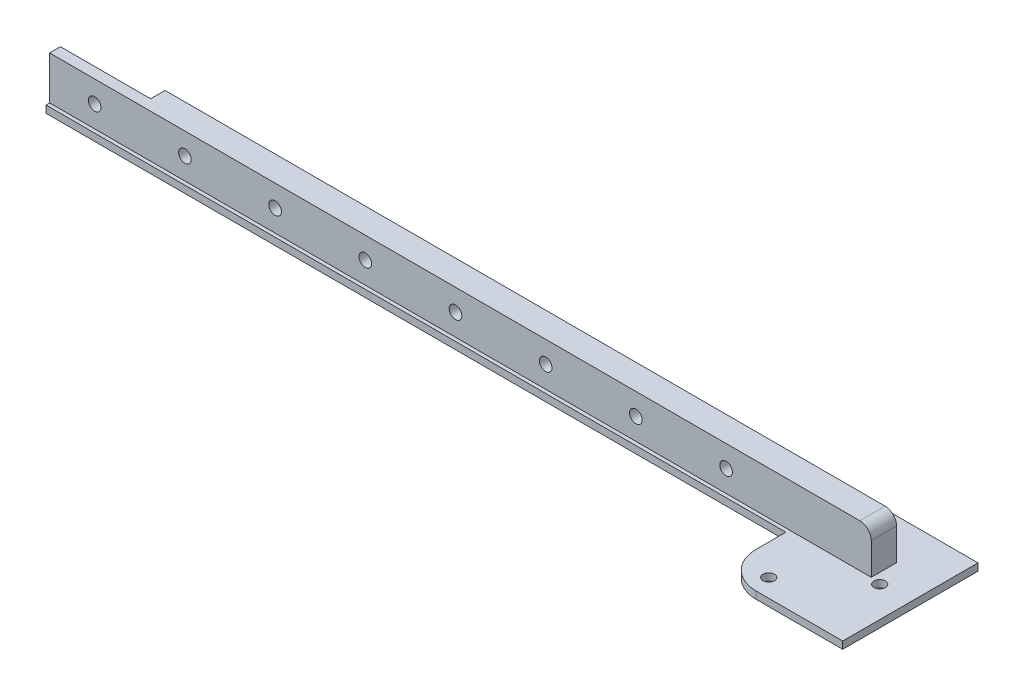
ISO-10303-21;
HEADER;
FILE_DESCRIPTION(('STEP AP214'),'2;1');
FILE_NAME('part.step','',(''),(''),'','','');
FILE_SCHEMA(('AUTOMOTIVE_DESIGN { 1 0 10303 214 1 1 1 1 }'));
ENDSEC;
DATA;
#1=APPLICATION_CONTEXT('core data for automotive mechanical design processes');
#2=APPLICATION_PROTOCOL_DEFINITION('international standard','automotive_design',2000,#1);
#3=PRODUCT_CONTEXT('',#1,'mechanical');
#4=PRODUCT('Part','Part','',(#3));
#5=PRODUCT_RELATED_PRODUCT_CATEGORY('part','',(#4));
#6=PRODUCT_DEFINITION_FORMATION('','',#4);
#7=PRODUCT_DEFINITION_CONTEXT('part definition',#1,'design');
#8=PRODUCT_DEFINITION('design','',#6,#7);
#9=PRODUCT_DEFINITION_SHAPE('','',#8);
#10=(LENGTH_UNIT() NAMED_UNIT(*) SI_UNIT(.MILLI.,.METRE.));
#11=(NAMED_UNIT(*) PLANE_ANGLE_UNIT() SI_UNIT($,.RADIAN.));
#12=(NAMED_UNIT(*) SI_UNIT($,.STERADIAN.) SOLID_ANGLE_UNIT());
#13=UNCERTAINTY_MEASURE_WITH_UNIT(LENGTH_MEASURE(1.E-05),#10,'distance_accuracy_value','');
#14=(GEOMETRIC_REPRESENTATION_CONTEXT(3) GLOBAL_UNCERTAINTY_ASSIGNED_CONTEXT((#13)) GLOBAL_UNIT_ASSIGNED_CONTEXT((#10,
#11,#12)) REPRESENTATION_CONTEXT('',''));
#15=CARTESIAN_POINT('',(0.,0.,0.));
#16=DIRECTION('',(0.,0.,1.));
#17=DIRECTION('',(1.,0.,0.));
#18=AXIS2_PLACEMENT_3D('',#15,#16,#17);
#19=CARTESIAN_POINT('',(-205.08,2.,-18.25));
#20=DIRECTION('',(1.,0.,0.));
#21=DIRECTION('',(0.,0.,-1.));
#22=AXIS2_PLACEMENT_3D('',#19,#20,#21);
#23=PLANE('',#22);
#24=DIRECTION('',(0.,1.,0.));
#25=VECTOR('',#24,1.);
#26=CARTESIAN_POINT('',(-205.08,14.,-22.25));
#27=LINE('',#26,#25);
#28=CARTESIAN_POINT('',(-205.08,0.,-22.25));
#29=VERTEX_POINT('',#28);
#30=CARTESIAN_POINT('',(-205.08,14.,-22.25));
#31=VERTEX_POINT('',#30);
#32=EDGE_CURVE('E176',#29,#31,#27,.T.);
#33=ORIENTED_EDGE('',*,*,#32,.F.);
#34=DIRECTION('',(0.,0.,1.));
#35=VECTOR('',#34,1.);
#36=CARTESIAN_POINT('',(-205.08,0.,-18.25));
#37=LINE('',#36,#35);
#38=CARTESIAN_POINT('',(-205.08,0.,-18.25));
#39=VERTEX_POINT('',#38);
#40=EDGE_CURVE('E175',#29,#39,#37,.T.);
#41=ORIENTED_EDGE('',*,*,#40,.T.);
#42=DIRECTION('',(0.,-1.,0.));
#43=VECTOR('',#42,1.);
#44=CARTESIAN_POINT('',(-205.08,2.,-18.25));
#45=LINE('',#44,#43);
#46=CARTESIAN_POINT('',(-205.08,2.,-18.25));
#47=VERTEX_POINT('',#46);
#48=EDGE_CURVE('E306',#47,#39,#45,.T.);
#49=ORIENTED_EDGE('',*,*,#48,.F.);
#50=DIRECTION('',(0.,0.,1.));
#51=VECTOR('',#50,1.);
#52=CARTESIAN_POINT('',(-205.08,2.,-18.25));
#53=LINE('',#52,#51);
#54=CARTESIAN_POINT('',(-205.08,2.,-19.25));
#55=VERTEX_POINT('',#54);
#56=EDGE_CURVE('E284',#55,#47,#53,.T.);
#57=ORIENTED_EDGE('',*,*,#56,.F.);
#58=DIRECTION('',(0.,-1.,0.));
#59=VECTOR('',#58,1.);
#60=CARTESIAN_POINT('',(-205.08,14.,-19.25));
#61=LINE('',#60,#59);
#62=CARTESIAN_POINT('',(-205.08,14.,-19.25));
#63=VERTEX_POINT('',#62);
#64=EDGE_CURVE('E249',#63,#55,#61,.T.);
#65=ORIENTED_EDGE('',*,*,#64,.F.);
#66=DIRECTION('',(0.,0.,1.));
#67=VECTOR('',#66,1.);
#68=CARTESIAN_POINT('',(-205.08,14.,-26.25));
#69=LINE('',#68,#67);
#70=EDGE_CURVE('E230',#31,#63,#69,.T.);
#71=ORIENTED_EDGE('',*,*,#70,.F.);
#72=EDGE_LOOP('',(#33,#41,#49,#57,#65,#71));
#73=FACE_BOUND('',#72,.T.);
#74=ADVANCED_FACE('F38',(#73),#23,.F.);
#75=CARTESIAN_POINT('',(-192.58,8.,-37.5));
#76=DIRECTION('',(0.,0.,1.));
#77=DIRECTION('',(1.,0.,0.));
#78=AXIS2_PLACEMENT_3D('',#75,#76,#77);
#79=CYLINDRICAL_SURFACE('',#78,1.75000000000001);
#80=CARTESIAN_POINT('',(-192.58,8.,-19.25));
#81=DIRECTION('',(0.,0.,1.));
#82=DIRECTION('',(1.,0.,0.));
#83=AXIS2_PLACEMENT_3D('',#80,#81,#82);
#84=CIRCLE('',#83,1.75000000000001);
#85=CARTESIAN_POINT('',(-190.83,8.,-19.25));
#86=VERTEX_POINT('',#85);
#87=EDGE_CURVE('E184',#86,#86,#84,.T.);
#88=ORIENTED_EDGE('',*,*,#87,.T.);
#89=EDGE_LOOP('',(#88));
#90=FACE_BOUND('',#89,.T.);
#91=CARTESIAN_POINT('',(-192.58,8.,-22.25));
#92=DIRECTION('',(0.,0.,-1.));
#93=DIRECTION('',(-1.,0.,0.));
#94=AXIS2_PLACEMENT_3D('',#91,#92,#93);
#95=CIRCLE('',#94,1.75000000000001);
#96=CARTESIAN_POINT('',(-194.33,8.,-22.25));
#97=VERTEX_POINT('',#96);
#98=EDGE_CURVE('E182',#97,#97,#95,.F.);
#99=ORIENTED_EDGE('',*,*,#98,.F.);
#100=EDGE_LOOP('',(#99));
#101=FACE_BOUND('',#100,.T.);
#102=ADVANCED_FACE('F402',(#90,#101),#79,.F.);
#103=CARTESIAN_POINT('',(0.,2.,0.));
#104=DIRECTION('',(0.,1.,0.));
#105=DIRECTION('',(0.,0.,1.));
#106=AXIS2_PLACEMENT_3D('',#103,#104,#105);
#107=PLANE('',#106);
#108=DIRECTION('',(-1.,0.,0.));
#109=VECTOR('',#108,1.);
#110=CARTESIAN_POINT('',(-205.08,2.,-26.25));
#111=LINE('',#110,#109);
#112=CARTESIAN_POINT('',(22.6666666666667,2.,-26.25));
#113=VERTEX_POINT('',#112);
#114=CARTESIAN_POINT('',(0.,2.,-26.25));
#115=VERTEX_POINT('',#114);
#116=EDGE_CURVE('E233',#113,#115,#111,.T.);
#117=ORIENTED_EDGE('',*,*,#116,.F.);
#118=DIRECTION('',(0.,0.,-1.));
#119=VECTOR('',#118,1.);
#120=CARTESIAN_POINT('',(22.6666666666667,2.,-26.25));
#121=LINE('',#120,#119);
#122=CARTESIAN_POINT('',(22.6666666666667,2.,-19.25));
#123=VERTEX_POINT('',#122);
#124=EDGE_CURVE('E241',#123,#113,#121,.T.);
#125=ORIENTED_EDGE('',*,*,#124,.F.);
#126=DIRECTION('',(1.,0.,0.));
#127=VECTOR('',#126,1.);
#128=CARTESIAN_POINT('',(-205.08,2.,-19.25));
#129=LINE('',#128,#127);
#130=EDGE_CURVE('E229',#55,#123,#129,.T.);
#131=ORIENTED_EDGE('',*,*,#130,.F.);
#132=ORIENTED_EDGE('',*,*,#56,.T.);
#133=DIRECTION('',(1.,0.,0.));
#134=VECTOR('',#133,1.);
#135=CARTESIAN_POINT('',(0.,2.,-18.25));
#136=LINE('',#135,#134);
#137=CARTESIAN_POINT('',(0.,2.,-18.25));
#138=VERTEX_POINT('',#137);
#139=EDGE_CURVE('E286',#47,#138,#136,.T.);
#140=ORIENTED_EDGE('',*,*,#139,.T.);
#141=DIRECTION('',(0.,0.,1.));
#142=VECTOR('',#141,1.);
#143=CARTESIAN_POINT('',(0.,2.,-18.25));
#144=LINE('',#143,#142);
#145=CARTESIAN_POINT('',(0.,2.,-9.99999999999999));
#146=VERTEX_POINT('',#145);
#147=EDGE_CURVE('E271',#138,#146,#144,.T.);
#148=ORIENTED_EDGE('',*,*,#147,.T.);
#149=CARTESIAN_POINT('',(9.99999999999999,2.,-10.));
#150=DIRECTION('',(0.,1.,0.));
#151=DIRECTION('',(0.,0.,1.));
#152=AXIS2_PLACEMENT_3D('',#149,#150,#151);
#153=CIRCLE('',#152,10.);
#154=CARTESIAN_POINT('',(9.99999999999999,2.,0.));
#155=VERTEX_POINT('',#154);
#156=EDGE_CURVE('E329',#146,#155,#153,.T.);
#157=ORIENTED_EDGE('',*,*,#156,.T.);
#158=DIRECTION('',(1.,0.,0.));
#159=VECTOR('',#158,1.);
#160=CARTESIAN_POINT('',(0.,2.,0.));
#161=LINE('',#160,#159);
#162=CARTESIAN_POINT('',(34.,2.,0.));
#163=VERTEX_POINT('',#162);
#164=EDGE_CURVE('E274',#155,#163,#161,.T.);
#165=ORIENTED_EDGE('',*,*,#164,.T.);
#166=DIRECTION('',(0.,0.,-1.));
#167=VECTOR('',#166,1.);
#168=CARTESIAN_POINT('',(34.,2.,0.));
#169=LINE('',#168,#167);
#170=CARTESIAN_POINT('',(34.,2.,-37.5));
#171=VERTEX_POINT('',#170);
#172=EDGE_CURVE('E277',#163,#171,#169,.T.);
#173=ORIENTED_EDGE('',*,*,#172,.T.);
#174=DIRECTION('',(-1.,0.,0.));
#175=VECTOR('',#174,1.);
#176=CARTESIAN_POINT('',(34.,2.,-37.5));
#177=LINE('',#176,#175);
#178=CARTESIAN_POINT('',(9.99999999999999,2.,-37.5));
#179=VERTEX_POINT('',#178);
#180=EDGE_CURVE('E279',#171,#179,#177,.T.);
#181=ORIENTED_EDGE('',*,*,#180,.T.);
#182=CARTESIAN_POINT('',(9.99999999999999,2.,-27.5));
#183=DIRECTION('',(0.,1.,0.));
#184=DIRECTION('',(0.,0.,1.));
#185=AXIS2_PLACEMENT_3D('',#182,#183,#184);
#186=CIRCLE('',#185,10.);
#187=CARTESIAN_POINT('',(0.,2.,-27.5));
#188=VERTEX_POINT('',#187);
#189=EDGE_CURVE('E327',#179,#188,#186,.T.);
#190=ORIENTED_EDGE('',*,*,#189,.T.);
#191=DIRECTION('',(0.,0.,1.));
#192=VECTOR('',#191,1.);
#193=CARTESIAN_POINT('',(0.,2.,-37.5));
#194=LINE('',#193,#192);
#195=EDGE_CURVE('E282',#188,#115,#194,.T.);
#196=ORIENTED_EDGE('',*,*,#195,.T.);
#197=EDGE_LOOP('',(#117,#125,#131,#132,#140,#148,#157,#165,#173,#181,#190,#196));
#198=FACE_BOUND('',#197,.T.);
#199=CARTESIAN_POINT('',(8.5,2.,-5.));
#200=DIRECTION('',(0.,1.,0.));
#201=DIRECTION('',(0.,0.,1.));
#202=AXIS2_PLACEMENT_3D('',#199,#200,#201);
#203=CIRCLE('',#202,1.59);
#204=CARTESIAN_POINT('',(8.5,2.,-3.41));
#205=VERTEX_POINT('',#204);
#206=EDGE_CURVE('E259',#205,#205,#203,.T.);
#207=ORIENTED_EDGE('',*,*,#206,.F.);
#208=EDGE_LOOP('',(#207));
#209=FACE_BOUND('',#208,.T.);
#210=CARTESIAN_POINT('',(8.5,2.,-32.5));
#211=DIRECTION('',(0.,1.,0.));
#212=DIRECTION('',(0.,0.,1.));
#213=AXIS2_PLACEMENT_3D('',#210,#211,#212);
#214=CIRCLE('',#213,1.59);
#215=CARTESIAN_POINT('',(8.5,2.,-30.91));
#216=VERTEX_POINT('',#215);
#217=EDGE_CURVE('E265',#216,#216,#214,.T.);
#218=ORIENTED_EDGE('',*,*,#217,.F.);
#219=EDGE_LOOP('',(#218));
#220=FACE_BOUND('',#219,.T.);
#221=CARTESIAN_POINT('',(25.5,2.,-18.75));
#222=DIRECTION('',(0.,1.,0.));
#223=DIRECTION('',(0.,0.,1.));
#224=AXIS2_PLACEMENT_3D('',#221,#222,#223);
#225=CIRCLE('',#224,1.59);
#226=CARTESIAN_POINT('',(25.5,2.,-17.16));
#227=VERTEX_POINT('',#226);
#228=EDGE_CURVE('E253',#227,#227,#225,.T.);
#229=ORIENTED_EDGE('',*,*,#228,.F.);
#230=EDGE_LOOP('',(#229));
#231=FACE_BOUND('',#230,.T.);
#232=ADVANCED_FACE('F364',(#198,#209,#220,#231),#107,.T.);
#233=CARTESIAN_POINT('',(0.,0.,0.));
#234=DIRECTION('',(0.,1.,0.));
#235=DIRECTION('',(0.,0.,1.));
#236=AXIS2_PLACEMENT_3D('',#233,#234,#235);
#237=PLANE('',#236);
#238=DIRECTION('',(-1.,0.,0.));
#239=VECTOR('',#238,1.);
#240=CARTESIAN_POINT('',(-180.08,0.,-22.25));
#241=LINE('',#240,#239);
#242=CARTESIAN_POINT('',(-180.08,0.,-22.25));
#243=VERTEX_POINT('',#242);
#244=EDGE_CURVE('E166',#243,#29,#241,.T.);
#245=ORIENTED_EDGE('',*,*,#244,.F.);
#246=DIRECTION('',(0.,0.,-1.));
#247=VECTOR('',#246,1.);
#248=CARTESIAN_POINT('',(-180.08,0.,-22.25));
#249=LINE('',#248,#247);
#250=CARTESIAN_POINT('',(-180.08,0.,-26.25));
#251=VERTEX_POINT('',#250);
#252=EDGE_CURVE('E148',#243,#251,#249,.T.);
#253=ORIENTED_EDGE('',*,*,#252,.T.);
#254=DIRECTION('',(-1.,0.,0.));
#255=VECTOR('',#254,1.);
#256=CARTESIAN_POINT('',(-205.08,0.,-26.25));
#257=LINE('',#256,#255);
#258=CARTESIAN_POINT('',(0.,0.,-26.25));
#259=VERTEX_POINT('',#258);
#260=EDGE_CURVE('E300',#259,#251,#257,.T.);
#261=ORIENTED_EDGE('',*,*,#260,.F.);
#262=DIRECTION('',(0.,0.,1.));
#263=VECTOR('',#262,1.);
#264=CARTESIAN_POINT('',(0.,0.,-37.5));
#265=LINE('',#264,#263);
#266=CARTESIAN_POINT('',(0.,0.,-27.5));
#267=VERTEX_POINT('',#266);
#268=EDGE_CURVE('E298',#267,#259,#265,.T.);
#269=ORIENTED_EDGE('',*,*,#268,.F.);
#270=CARTESIAN_POINT('',(9.99999999999999,0.,-27.5));
#271=DIRECTION('',(0.,1.,0.));
#272=DIRECTION('',(0.,0.,1.));
#273=AXIS2_PLACEMENT_3D('',#270,#271,#272);
#274=CIRCLE('',#273,10.);
#275=CARTESIAN_POINT('',(9.99999999999999,0.,-37.5));
#276=VERTEX_POINT('',#275);
#277=EDGE_CURVE('E321',#267,#276,#274,.F.);
#278=ORIENTED_EDGE('',*,*,#277,.T.);
#279=DIRECTION('',(-1.,0.,0.));
#280=VECTOR('',#279,1.);
#281=CARTESIAN_POINT('',(34.,0.,-37.5));
#282=LINE('',#281,#280);
#283=CARTESIAN_POINT('',(34.,0.,-37.5));
#284=VERTEX_POINT('',#283);
#285=EDGE_CURVE('E295',#284,#276,#282,.T.);
#286=ORIENTED_EDGE('',*,*,#285,.F.);
#287=DIRECTION('',(0.,0.,-1.));
#288=VECTOR('',#287,1.);
#289=CARTESIAN_POINT('',(34.,0.,0.));
#290=LINE('',#289,#288);
#291=CARTESIAN_POINT('',(34.,0.,0.));
#292=VERTEX_POINT('',#291);
#293=EDGE_CURVE('E293',#292,#284,#290,.T.);
#294=ORIENTED_EDGE('',*,*,#293,.F.);
#295=DIRECTION('',(1.,0.,0.));
#296=VECTOR('',#295,1.);
#297=CARTESIAN_POINT('',(0.,0.,0.));
#298=LINE('',#297,#296);
#299=CARTESIAN_POINT('',(9.99999999999999,0.,0.));
#300=VERTEX_POINT('',#299);
#301=EDGE_CURVE('E291',#300,#292,#298,.T.);
#302=ORIENTED_EDGE('',*,*,#301,.F.);
#303=CARTESIAN_POINT('',(9.99999999999999,0.,-10.));
#304=DIRECTION('',(0.,1.,0.));
#305=DIRECTION('',(0.,0.,1.));
#306=AXIS2_PLACEMENT_3D('',#303,#304,#305);
#307=CIRCLE('',#306,10.);
#308=CARTESIAN_POINT('',(0.,0.,-9.99999999999999));
#309=VERTEX_POINT('',#308);
#310=EDGE_CURVE('E323',#300,#309,#307,.F.);
#311=ORIENTED_EDGE('',*,*,#310,.T.);
#312=DIRECTION('',(0.,0.,1.));
#313=VECTOR('',#312,1.);
#314=CARTESIAN_POINT('',(0.,0.,-18.25));
#315=LINE('',#314,#313);
#316=CARTESIAN_POINT('',(0.,0.,-18.25));
#317=VERTEX_POINT('',#316);
#318=EDGE_CURVE('E268',#317,#309,#315,.T.);
#319=ORIENTED_EDGE('',*,*,#318,.F.);
#320=DIRECTION('',(1.,0.,0.));
#321=VECTOR('',#320,1.);
#322=CARTESIAN_POINT('',(0.,0.,-18.25));
#323=LINE('',#322,#321);
#324=EDGE_CURVE('E275',#39,#317,#323,.T.);
#325=ORIENTED_EDGE('',*,*,#324,.F.);
#326=ORIENTED_EDGE('',*,*,#40,.F.);
#327=EDGE_LOOP('',(#245,#253,#261,#269,#278,#286,#294,#302,#311,#319,#325,#326));
#328=FACE_BOUND('',#327,.T.);
#329=CARTESIAN_POINT('',(8.5,0.,-32.5));
#330=DIRECTION('',(0.,1.,0.));
#331=DIRECTION('',(0.,0.,1.));
#332=AXIS2_PLACEMENT_3D('',#329,#330,#331);
#333=CIRCLE('',#332,1.59);
#334=CARTESIAN_POINT('',(8.5,0.,-30.91));
#335=VERTEX_POINT('',#334);
#336=EDGE_CURVE('E262',#335,#335,#333,.T.);
#337=ORIENTED_EDGE('',*,*,#336,.T.);
#338=EDGE_LOOP('',(#337));
#339=FACE_BOUND('',#338,.T.);
#340=CARTESIAN_POINT('',(8.5,0.,-5.));
#341=DIRECTION('',(0.,1.,0.));
#342=DIRECTION('',(0.,0.,1.));
#343=AXIS2_PLACEMENT_3D('',#340,#341,#342);
#344=CIRCLE('',#343,1.59);
#345=CARTESIAN_POINT('',(8.5,0.,-3.41));
#346=VERTEX_POINT('',#345);
#347=EDGE_CURVE('E256',#346,#346,#344,.T.);
#348=ORIENTED_EDGE('',*,*,#347,.T.);
#349=EDGE_LOOP('',(#348));
#350=FACE_BOUND('',#349,.T.);
#351=CARTESIAN_POINT('',(25.5,0.,-18.75));
#352=DIRECTION('',(0.,1.,0.));
#353=DIRECTION('',(0.,0.,1.));
#354=AXIS2_PLACEMENT_3D('',#351,#352,#353);
#355=CIRCLE('',#354,1.59);
#356=CARTESIAN_POINT('',(25.5,0.,-17.16));
#357=VERTEX_POINT('',#356);
#358=EDGE_CURVE('E252',#357,#357,#355,.T.);
#359=ORIENTED_EDGE('',*,*,#358,.T.);
#360=EDGE_LOOP('',(#359));
#361=FACE_BOUND('',#360,.T.);
#362=ADVANCED_FACE('F172',(#328,#339,#350,#361),#237,.F.);
#363=CARTESIAN_POINT('',(0.,2.,-18.25));
#364=DIRECTION('',(1.,0.,0.));
#365=DIRECTION('',(0.,0.,-1.));
#366=AXIS2_PLACEMENT_3D('',#363,#364,#365);
#367=PLANE('',#366);
#368=ORIENTED_EDGE('',*,*,#318,.T.);
#369=DIRECTION('',(0.,-1.,0.));
#370=VECTOR('',#369,1.);
#371=CARTESIAN_POINT('',(0.,2.,-9.99999999999999));
#372=LINE('',#371,#370);
#373=EDGE_CURVE('E325',#309,#146,#372,.F.);
#374=ORIENTED_EDGE('',*,*,#373,.T.);
#375=ORIENTED_EDGE('',*,*,#147,.F.);
#376=DIRECTION('',(0.,-1.,0.));
#377=VECTOR('',#376,1.);
#378=CARTESIAN_POINT('',(0.,2.,-18.25));
#379=LINE('',#378,#377);
#380=EDGE_CURVE('E288',#138,#317,#379,.T.);
#381=ORIENTED_EDGE('',*,*,#380,.T.);
#382=EDGE_LOOP('',(#368,#374,#375,#381));
#383=FACE_BOUND('',#382,.T.);
#384=ADVANCED_FACE('F384',(#383),#367,.F.);
#385=CARTESIAN_POINT('',(0.,2.,0.));
#386=DIRECTION('',(0.,0.,-1.));
#387=DIRECTION('',(-1.,0.,0.));
#388=AXIS2_PLACEMENT_3D('',#385,#386,#387);
#389=PLANE('',#388);
#390=ORIENTED_EDGE('',*,*,#164,.F.);
#391=DIRECTION('',(0.,-1.,0.));
#392=VECTOR('',#391,1.);
#393=CARTESIAN_POINT('',(9.99999999999999,2.,0.));
#394=LINE('',#393,#392);
#395=EDGE_CURVE('E318',#155,#300,#394,.T.);
#396=ORIENTED_EDGE('',*,*,#395,.T.);
#397=ORIENTED_EDGE('',*,*,#301,.T.);
#398=DIRECTION('',(0.,-1.,0.));
#399=VECTOR('',#398,1.);
#400=CARTESIAN_POINT('',(34.,2.,0.));
#401=LINE('',#400,#399);
#402=EDGE_CURVE('E315',#163,#292,#401,.T.);
#403=ORIENTED_EDGE('',*,*,#402,.F.);
#404=EDGE_LOOP('',(#390,#396,#397,#403));
#405=FACE_BOUND('',#404,.T.);
#406=ADVANCED_FACE('F376',(#405),#389,.F.);
#407=CARTESIAN_POINT('',(34.,2.,0.));
#408=DIRECTION('',(-1.,0.,0.));
#409=DIRECTION('',(0.,0.,1.));
#410=AXIS2_PLACEMENT_3D('',#407,#408,#409);
#411=PLANE('',#410);
#412=ORIENTED_EDGE('',*,*,#293,.T.);
#413=DIRECTION('',(0.,-1.,0.));
#414=VECTOR('',#413,1.);
#415=CARTESIAN_POINT('',(34.,2.,-37.5));
#416=LINE('',#415,#414);
#417=EDGE_CURVE('E312',#171,#284,#416,.T.);
#418=ORIENTED_EDGE('',*,*,#417,.F.);
#419=ORIENTED_EDGE('',*,*,#172,.F.);
#420=ORIENTED_EDGE('',*,*,#402,.T.);
#421=EDGE_LOOP('',(#412,#418,#419,#420));
#422=FACE_BOUND('',#421,.T.);
#423=ADVANCED_FACE('F371',(#422),#411,.F.);
#424=CARTESIAN_POINT('',(34.,2.,-37.5));
#425=DIRECTION('',(0.,0.,1.));
#426=DIRECTION('',(1.,0.,0.));
#427=AXIS2_PLACEMENT_3D('',#424,#425,#426);
#428=PLANE('',#427);
#429=ORIENTED_EDGE('',*,*,#285,.T.);
#430=DIRECTION('',(0.,-1.,0.));
#431=VECTOR('',#430,1.);
#432=CARTESIAN_POINT('',(9.99999999999999,2.,-37.5));
#433=LINE('',#432,#431);
#434=EDGE_CURVE('E334',#276,#179,#433,.F.);
#435=ORIENTED_EDGE('',*,*,#434,.T.);
#436=ORIENTED_EDGE('',*,*,#180,.F.);
#437=ORIENTED_EDGE('',*,*,#417,.T.);
#438=EDGE_LOOP('',(#429,#435,#436,#437));
#439=FACE_BOUND('',#438,.T.);
#440=ADVANCED_FACE('F361',(#439),#428,.F.);
#441=CARTESIAN_POINT('',(0.,2.,-37.5));
#442=DIRECTION('',(1.,0.,0.));
#443=DIRECTION('',(0.,0.,-1.));
#444=AXIS2_PLACEMENT_3D('',#441,#442,#443);
#445=PLANE('',#444);
#446=ORIENTED_EDGE('',*,*,#195,.F.);
#447=DIRECTION('',(0.,-1.,0.));
#448=VECTOR('',#447,1.);
#449=CARTESIAN_POINT('',(0.,2.,-27.5));
#450=LINE('',#449,#448);
#451=EDGE_CURVE('E331',#188,#267,#450,.T.);
#452=ORIENTED_EDGE('',*,*,#451,.T.);
#453=ORIENTED_EDGE('',*,*,#268,.T.);
#454=DIRECTION('',(0.,-1.,0.));
#455=VECTOR('',#454,1.);
#456=CARTESIAN_POINT('',(0.,2.,-26.25));
#457=LINE('',#456,#455);
#458=EDGE_CURVE('E309',#115,#259,#457,.T.);
#459=ORIENTED_EDGE('',*,*,#458,.F.);
#460=EDGE_LOOP('',(#446,#452,#453,#459));
#461=FACE_BOUND('',#460,.T.);
#462=ADVANCED_FACE('F353',(#461),#445,.F.);
#463=CARTESIAN_POINT('',(-205.08,2.,-26.25));
#464=DIRECTION('',(0.,0.,1.));
#465=DIRECTION('',(1.,0.,0.));
#466=AXIS2_PLACEMENT_3D('',#463,#464,#465);
#467=PLANE('',#466);
#468=CARTESIAN_POINT('',(-167.58,8.,-26.25));
#469=DIRECTION('',(0.,0.,1.));
#470=DIRECTION('',(1.,0.,0.));
#471=AXIS2_PLACEMENT_3D('',#468,#469,#470);
#472=CIRCLE('',#471,1.75000000000001);
#473=CARTESIAN_POINT('',(-165.83,8.,-26.25));
#474=VERTEX_POINT('',#473);
#475=EDGE_CURVE('E226',#474,#474,#472,.T.);
#476=ORIENTED_EDGE('',*,*,#475,.T.);
#477=EDGE_LOOP('',(#476));
#478=FACE_BOUND('',#477,.T.);
#479=CARTESIAN_POINT('',(-142.58,8.,-26.25));
#480=DIRECTION('',(0.,0.,1.));
#481=DIRECTION('',(1.,0.,0.));
#482=AXIS2_PLACEMENT_3D('',#479,#480,#481);
#483=CIRCLE('',#482,1.74999999999998);
#484=CARTESIAN_POINT('',(-140.83,8.,-26.25));
#485=VERTEX_POINT('',#484);
#486=EDGE_CURVE('E223',#485,#485,#483,.T.);
#487=ORIENTED_EDGE('',*,*,#486,.T.);
#488=EDGE_LOOP('',(#487));
#489=FACE_BOUND('',#488,.T.);
#490=CARTESIAN_POINT('',(-117.58,8.,-26.25));
#491=DIRECTION('',(0.,0.,1.));
#492=DIRECTION('',(1.,0.,0.));
#493=AXIS2_PLACEMENT_3D('',#490,#491,#492);
#494=CIRCLE('',#493,1.75000000000001);
#495=CARTESIAN_POINT('',(-115.83,8.,-26.25));
#496=VERTEX_POINT('',#495);
#497=EDGE_CURVE('E220',#496,#496,#494,.T.);
#498=ORIENTED_EDGE('',*,*,#497,.T.);
#499=EDGE_LOOP('',(#498));
#500=FACE_BOUND('',#499,.T.);
#501=CARTESIAN_POINT('',(-92.58,8.,-26.25));
#502=DIRECTION('',(0.,0.,1.));
#503=DIRECTION('',(1.,0.,0.));
#504=AXIS2_PLACEMENT_3D('',#501,#502,#503);
#505=CIRCLE('',#504,1.75000000000001);
#506=CARTESIAN_POINT('',(-90.83,8.,-26.25));
#507=VERTEX_POINT('',#506);
#508=EDGE_CURVE('E217',#507,#507,#505,.T.);
#509=ORIENTED_EDGE('',*,*,#508,.T.);
#510=EDGE_LOOP('',(#509));
#511=FACE_BOUND('',#510,.T.);
#512=CARTESIAN_POINT('',(-67.58,8.,-26.25));
#513=DIRECTION('',(0.,0.,1.));
#514=DIRECTION('',(1.,0.,0.));
#515=AXIS2_PLACEMENT_3D('',#512,#513,#514);
#516=CIRCLE('',#515,1.75000000000001);
#517=CARTESIAN_POINT('',(-65.83,8.,-26.25));
#518=VERTEX_POINT('',#517);
#519=EDGE_CURVE('E214',#518,#518,#516,.T.);
#520=ORIENTED_EDGE('',*,*,#519,.T.);
#521=EDGE_LOOP('',(#520));
#522=FACE_BOUND('',#521,.T.);
#523=CARTESIAN_POINT('',(-42.58,8.,-26.25));
#524=DIRECTION('',(0.,0.,1.));
#525=DIRECTION('',(1.,0.,0.));
#526=AXIS2_PLACEMENT_3D('',#523,#524,#525);
#527=CIRCLE('',#526,1.75000000000001);
#528=CARTESIAN_POINT('',(-40.83,8.,-26.25));
#529=VERTEX_POINT('',#528);
#530=EDGE_CURVE('E211',#529,#529,#527,.T.);
#531=ORIENTED_EDGE('',*,*,#530,.T.);
#532=EDGE_LOOP('',(#531));
#533=FACE_BOUND('',#532,.T.);
#534=CARTESIAN_POINT('',(-17.58,8.,-26.25));
#535=DIRECTION('',(0.,0.,1.));
#536=DIRECTION('',(1.,0.,0.));
#537=AXIS2_PLACEMENT_3D('',#534,#535,#536);
#538=CIRCLE('',#537,1.75000000000001);
#539=CARTESIAN_POINT('',(-15.83,8.,-26.25));
#540=VERTEX_POINT('',#539);
#541=EDGE_CURVE('E187',#540,#540,#538,.T.);
#542=ORIENTED_EDGE('',*,*,#541,.T.);
#543=EDGE_LOOP('',(#542));
#544=FACE_BOUND('',#543,.T.);
#545=DIRECTION('',(-1.,0.,0.));
#546=VECTOR('',#545,1.);
#547=CARTESIAN_POINT('',(-205.08,14.,-26.25));
#548=LINE('',#547,#546);
#549=CARTESIAN_POINT('',(19.4916666666667,14.,-26.25));
#550=VERTEX_POINT('',#549);
#551=CARTESIAN_POINT('',(-180.08,14.,-26.25));
#552=VERTEX_POINT('',#551);
#553=EDGE_CURVE('E236',#550,#552,#548,.T.);
#554=ORIENTED_EDGE('',*,*,#553,.F.);
#555=CARTESIAN_POINT('',(19.4916666666667,10.825,-26.25));
#556=DIRECTION('',(0.,0.,1.));
#557=DIRECTION('',(1.,0.,0.));
#558=AXIS2_PLACEMENT_3D('',#555,#556,#557);
#559=CIRCLE('',#558,3.175);
#560=CARTESIAN_POINT('',(22.6666666666667,10.825,-26.25));
#561=VERTEX_POINT('',#560);
#562=EDGE_CURVE('E60',#550,#561,#559,.F.);
#563=ORIENTED_EDGE('',*,*,#562,.T.);
#564=DIRECTION('',(0.,-1.,0.));
#565=VECTOR('',#564,1.);
#566=CARTESIAN_POINT('',(22.6666666666667,14.,-26.25));
#567=LINE('',#566,#565);
#568=EDGE_CURVE('E238',#561,#113,#567,.T.);
#569=ORIENTED_EDGE('',*,*,#568,.T.);
#570=ORIENTED_EDGE('',*,*,#116,.T.);
#571=ORIENTED_EDGE('',*,*,#458,.T.);
#572=ORIENTED_EDGE('',*,*,#260,.T.);
#573=DIRECTION('',(0.,-1.,0.));
#574=VECTOR('',#573,1.);
#575=CARTESIAN_POINT('',(-180.08,14.,-26.25));
#576=LINE('',#575,#574);
#577=EDGE_CURVE('E155',#552,#251,#576,.T.);
#578=ORIENTED_EDGE('',*,*,#577,.F.);
#579=EDGE_LOOP('',(#554,#563,#569,#570,#571,#572,#578));
#580=FACE_BOUND('',#579,.T.);
#581=ADVANCED_FACE('F347',(#478,#489,#500,#511,#522,#533,#544,#580),#467,.F.);
#582=CARTESIAN_POINT('',(0.,2.,-18.25));
#583=DIRECTION('',(0.,0.,-1.));
#584=DIRECTION('',(-1.,0.,0.));
#585=AXIS2_PLACEMENT_3D('',#582,#583,#584);
#586=PLANE('',#585);
#587=ORIENTED_EDGE('',*,*,#324,.T.);
#588=ORIENTED_EDGE('',*,*,#380,.F.);
#589=ORIENTED_EDGE('',*,*,#139,.F.);
#590=ORIENTED_EDGE('',*,*,#48,.T.);
#591=EDGE_LOOP('',(#587,#588,#589,#590));
#592=FACE_BOUND('',#591,.T.);
#593=ADVANCED_FACE('F390',(#592),#586,.F.);
#594=CARTESIAN_POINT('',(8.5,2.,-32.5));
#595=DIRECTION('',(0.,-1.,0.));
#596=DIRECTION('',(0.,0.,-1.));
#597=AXIS2_PLACEMENT_3D('',#594,#595,#596);
#598=CYLINDRICAL_SURFACE('',#597,1.59);
#599=ORIENTED_EDGE('',*,*,#217,.T.);
#600=EDGE_LOOP('',(#599));
#601=FACE_BOUND('',#600,.T.);
#602=ORIENTED_EDGE('',*,*,#336,.F.);
#603=EDGE_LOOP('',(#602));
#604=FACE_BOUND('',#603,.T.);
#605=ADVANCED_FACE('F448',(#601,#604),#598,.F.);
#606=CARTESIAN_POINT('',(8.5,2.,-5.));
#607=DIRECTION('',(0.,-1.,0.));
#608=DIRECTION('',(0.,0.,-1.));
#609=AXIS2_PLACEMENT_3D('',#606,#607,#608);
#610=CYLINDRICAL_SURFACE('',#609,1.59);
#611=ORIENTED_EDGE('',*,*,#206,.T.);
#612=EDGE_LOOP('',(#611));
#613=FACE_BOUND('',#612,.T.);
#614=ORIENTED_EDGE('',*,*,#347,.F.);
#615=EDGE_LOOP('',(#614));
#616=FACE_BOUND('',#615,.T.);
#617=ADVANCED_FACE('F444',(#613,#616),#610,.F.);
#618=CARTESIAN_POINT('',(25.5,2.,-18.75));
#619=DIRECTION('',(0.,-1.,0.));
#620=DIRECTION('',(0.,0.,-1.));
#621=AXIS2_PLACEMENT_3D('',#618,#619,#620);
#622=CYLINDRICAL_SURFACE('',#621,1.59);
#623=ORIENTED_EDGE('',*,*,#228,.T.);
#624=EDGE_LOOP('',(#623));
#625=FACE_BOUND('',#624,.T.);
#626=ORIENTED_EDGE('',*,*,#358,.F.);
#627=EDGE_LOOP('',(#626));
#628=FACE_BOUND('',#627,.T.);
#629=ADVANCED_FACE('F426',(#625,#628),#622,.F.);
#630=CARTESIAN_POINT('',(9.99999999999999,2.,-10.));
#631=DIRECTION('',(0.,-1.,0.));
#632=DIRECTION('',(0.,0.,-1.));
#633=AXIS2_PLACEMENT_3D('',#630,#631,#632);
#634=CYLINDRICAL_SURFACE('',#633,10.);
#635=ORIENTED_EDGE('',*,*,#156,.F.);
#636=ORIENTED_EDGE('',*,*,#373,.F.);
#637=ORIENTED_EDGE('',*,*,#310,.F.);
#638=ORIENTED_EDGE('',*,*,#395,.F.);
#639=EDGE_LOOP('',(#635,#636,#637,#638));
#640=FACE_BOUND('',#639,.T.);
#641=ADVANCED_FACE('F380',(#640),#634,.T.);
#642=CARTESIAN_POINT('',(9.99999999999999,2.,-27.5));
#643=DIRECTION('',(0.,-1.,0.));
#644=DIRECTION('',(0.,0.,-1.));
#645=AXIS2_PLACEMENT_3D('',#642,#643,#644);
#646=CYLINDRICAL_SURFACE('',#645,10.);
#647=ORIENTED_EDGE('',*,*,#189,.F.);
#648=ORIENTED_EDGE('',*,*,#434,.F.);
#649=ORIENTED_EDGE('',*,*,#277,.F.);
#650=ORIENTED_EDGE('',*,*,#451,.F.);
#651=EDGE_LOOP('',(#647,#648,#649,#650));
#652=FACE_BOUND('',#651,.T.);
#653=ADVANCED_FACE('F357',(#652),#646,.T.);
#654=CARTESIAN_POINT('',(-205.08,14.,-19.25));
#655=DIRECTION('',(0.,0.,-1.));
#656=DIRECTION('',(-1.,0.,0.));
#657=AXIS2_PLACEMENT_3D('',#654,#655,#656);
#658=PLANE('',#657);
#659=ORIENTED_EDGE('',*,*,#87,.F.);
#660=EDGE_LOOP('',(#659));
#661=FACE_BOUND('',#660,.T.);
#662=CARTESIAN_POINT('',(-167.58,8.,-19.25));
#663=DIRECTION('',(0.,0.,1.));
#664=DIRECTION('',(1.,0.,0.));
#665=AXIS2_PLACEMENT_3D('',#662,#663,#664);
#666=CIRCLE('',#665,1.75000000000001);
#667=CARTESIAN_POINT('',(-165.83,8.,-19.25));
#668=VERTEX_POINT('',#667);
#669=EDGE_CURVE('E188',#668,#668,#666,.T.);
#670=ORIENTED_EDGE('',*,*,#669,.F.);
#671=EDGE_LOOP('',(#670));
#672=FACE_BOUND('',#671,.T.);
#673=CARTESIAN_POINT('',(-142.58,8.,-19.25));
#674=DIRECTION('',(0.,0.,1.));
#675=DIRECTION('',(1.,0.,0.));
#676=AXIS2_PLACEMENT_3D('',#673,#674,#675);
#677=CIRCLE('',#676,1.74999999999998);
#678=CARTESIAN_POINT('',(-140.83,8.,-19.25));
#679=VERTEX_POINT('',#678);
#680=EDGE_CURVE('E191',#679,#679,#677,.T.);
#681=ORIENTED_EDGE('',*,*,#680,.F.);
#682=EDGE_LOOP('',(#681));
#683=FACE_BOUND('',#682,.T.);
#684=CARTESIAN_POINT('',(-117.58,8.,-19.25));
#685=DIRECTION('',(0.,0.,1.));
#686=DIRECTION('',(1.,0.,0.));
#687=AXIS2_PLACEMENT_3D('',#684,#685,#686);
#688=CIRCLE('',#687,1.75000000000001);
#689=CARTESIAN_POINT('',(-115.83,8.,-19.25));
#690=VERTEX_POINT('',#689);
#691=EDGE_CURVE('E194',#690,#690,#688,.T.);
#692=ORIENTED_EDGE('',*,*,#691,.F.);
#693=EDGE_LOOP('',(#692));
#694=FACE_BOUND('',#693,.T.);
#695=CARTESIAN_POINT('',(-92.58,8.,-19.25));
#696=DIRECTION('',(0.,0.,1.));
#697=DIRECTION('',(1.,0.,0.));
#698=AXIS2_PLACEMENT_3D('',#695,#696,#697);
#699=CIRCLE('',#698,1.75000000000001);
#700=CARTESIAN_POINT('',(-90.83,8.,-19.25));
#701=VERTEX_POINT('',#700);
#702=EDGE_CURVE('E197',#701,#701,#699,.T.);
#703=ORIENTED_EDGE('',*,*,#702,.F.);
#704=EDGE_LOOP('',(#703));
#705=FACE_BOUND('',#704,.T.);
#706=CARTESIAN_POINT('',(-67.58,8.,-19.25));
#707=DIRECTION('',(0.,0.,1.));
#708=DIRECTION('',(1.,0.,0.));
#709=AXIS2_PLACEMENT_3D('',#706,#707,#708);
#710=CIRCLE('',#709,1.75000000000001);
#711=CARTESIAN_POINT('',(-65.83,8.,-19.25));
#712=VERTEX_POINT('',#711);
#713=EDGE_CURVE('E200',#712,#712,#710,.T.);
#714=ORIENTED_EDGE('',*,*,#713,.F.);
#715=EDGE_LOOP('',(#714));
#716=FACE_BOUND('',#715,.T.);
#717=CARTESIAN_POINT('',(-42.58,8.,-19.25));
#718=DIRECTION('',(0.,0.,1.));
#719=DIRECTION('',(1.,0.,0.));
#720=AXIS2_PLACEMENT_3D('',#717,#718,#719);
#721=CIRCLE('',#720,1.75000000000001);
#722=CARTESIAN_POINT('',(-40.83,8.,-19.25));
#723=VERTEX_POINT('',#722);
#724=EDGE_CURVE('E203',#723,#723,#721,.T.);
#725=ORIENTED_EDGE('',*,*,#724,.F.);
#726=EDGE_LOOP('',(#725));
#727=FACE_BOUND('',#726,.T.);
#728=CARTESIAN_POINT('',(-17.58,8.,-19.25));
#729=DIRECTION('',(0.,0.,1.));
#730=DIRECTION('',(1.,0.,0.));
#731=AXIS2_PLACEMENT_3D('',#728,#729,#730);
#732=CIRCLE('',#731,1.75000000000001);
#733=CARTESIAN_POINT('',(-15.83,8.,-19.25));
#734=VERTEX_POINT('',#733);
#735=EDGE_CURVE('E206',#734,#734,#732,.T.);
#736=ORIENTED_EDGE('',*,*,#735,.F.);
#737=EDGE_LOOP('',(#736));
#738=FACE_BOUND('',#737,.T.);
#739=DIRECTION('',(0.,-1.,0.));
#740=VECTOR('',#739,1.);
#741=CARTESIAN_POINT('',(22.6666666666667,14.,-19.25));
#742=LINE('',#741,#740);
#743=CARTESIAN_POINT('',(22.6666666666667,10.825,-19.25));
#744=VERTEX_POINT('',#743);
#745=EDGE_CURVE('E247',#744,#123,#742,.T.);
#746=ORIENTED_EDGE('',*,*,#745,.F.);
#747=CARTESIAN_POINT('',(19.4916666666667,10.825,-19.25));
#748=DIRECTION('',(0.,0.,-1.));
#749=DIRECTION('',(-1.,0.,0.));
#750=AXIS2_PLACEMENT_3D('',#747,#748,#749);
#751=CIRCLE('',#750,3.175);
#752=CARTESIAN_POINT('',(19.4916666666667,14.,-19.25));
#753=VERTEX_POINT('',#752);
#754=EDGE_CURVE('E11',#744,#753,#751,.F.);
#755=ORIENTED_EDGE('',*,*,#754,.T.);
#756=DIRECTION('',(1.,0.,0.));
#757=VECTOR('',#756,1.);
#758=CARTESIAN_POINT('',(-205.08,14.,-19.25));
#759=LINE('',#758,#757);
#760=EDGE_CURVE('E232',#63,#753,#759,.T.);
#761=ORIENTED_EDGE('',*,*,#760,.F.);
#762=ORIENTED_EDGE('',*,*,#64,.T.);
#763=ORIENTED_EDGE('',*,*,#130,.T.);
#764=EDGE_LOOP('',(#746,#755,#761,#762,#763));
#765=FACE_BOUND('',#764,.T.);
#766=ADVANCED_FACE('F395',(#661,#672,#683,#694,#705,#716,#727,#738,#765),#658,.F.);
#767=CARTESIAN_POINT('',(22.6666666666667,14.,-26.25));
#768=DIRECTION('',(-1.,0.,0.));
#769=DIRECTION('',(0.,0.,1.));
#770=AXIS2_PLACEMENT_3D('',#767,#768,#769);
#771=PLANE('',#770);
#772=ORIENTED_EDGE('',*,*,#568,.F.);
#773=DIRECTION('',(0.,0.,-1.));
#774=VECTOR('',#773,1.);
#775=CARTESIAN_POINT('',(22.6666666666667,10.825,-19.25));
#776=LINE('',#775,#774);
#777=EDGE_CURVE('E46',#561,#744,#776,.F.);
#778=ORIENTED_EDGE('',*,*,#777,.T.);
#779=ORIENTED_EDGE('',*,*,#745,.T.);
#780=ORIENTED_EDGE('',*,*,#124,.T.);
#781=EDGE_LOOP('',(#772,#778,#779,#780));
#782=FACE_BOUND('',#781,.T.);
#783=ADVANCED_FACE('F431',(#782),#771,.F.);
#784=CARTESIAN_POINT('',(0.,14.,0.));
#785=DIRECTION('',(0.,1.,0.));
#786=DIRECTION('',(0.,0.,1.));
#787=AXIS2_PLACEMENT_3D('',#784,#785,#786);
#788=PLANE('',#787);
#789=ORIENTED_EDGE('',*,*,#760,.T.);
#790=DIRECTION('',(0.,0.,-1.));
#791=VECTOR('',#790,1.);
#792=CARTESIAN_POINT('',(19.4916666666667,14.,-26.25));
#793=LINE('',#792,#791);
#794=EDGE_CURVE('E336',#753,#550,#793,.T.);
#795=ORIENTED_EDGE('',*,*,#794,.T.);
#796=ORIENTED_EDGE('',*,*,#553,.T.);
#797=DIRECTION('',(0.,0.,-1.));
#798=VECTOR('',#797,1.);
#799=CARTESIAN_POINT('',(-180.08,14.,-22.25));
#800=LINE('',#799,#798);
#801=CARTESIAN_POINT('',(-180.08,14.,-22.25));
#802=VERTEX_POINT('',#801);
#803=EDGE_CURVE('E160',#802,#552,#800,.T.);
#804=ORIENTED_EDGE('',*,*,#803,.F.);
#805=DIRECTION('',(1.,0.,0.));
#806=VECTOR('',#805,1.);
#807=CARTESIAN_POINT('',(-180.08,14.,-22.25));
#808=LINE('',#807,#806);
#809=EDGE_CURVE('E161',#31,#802,#808,.T.);
#810=ORIENTED_EDGE('',*,*,#809,.F.);
#811=ORIENTED_EDGE('',*,*,#70,.T.);
#812=EDGE_LOOP('',(#789,#795,#796,#804,#810,#811));
#813=FACE_BOUND('',#812,.T.);
#814=ADVANCED_FACE('F343',(#813),#788,.T.);
#815=CARTESIAN_POINT('',(-17.58,8.,-37.5));
#816=DIRECTION('',(0.,0.,1.));
#817=DIRECTION('',(1.,0.,0.));
#818=AXIS2_PLACEMENT_3D('',#815,#816,#817);
#819=CYLINDRICAL_SURFACE('',#818,1.75000000000001);
#820=ORIENTED_EDGE('',*,*,#735,.T.);
#821=EDGE_LOOP('',(#820));
#822=FACE_BOUND('',#821,.T.);
#823=ORIENTED_EDGE('',*,*,#541,.F.);
#824=EDGE_LOOP('',(#823));
#825=FACE_BOUND('',#824,.T.);
#826=ADVANCED_FACE('F589',(#822,#825),#819,.F.);
#827=CARTESIAN_POINT('',(-42.58,8.,-37.5));
#828=DIRECTION('',(0.,0.,1.));
#829=DIRECTION('',(1.,0.,0.));
#830=AXIS2_PLACEMENT_3D('',#827,#828,#829);
#831=CYLINDRICAL_SURFACE('',#830,1.75000000000001);
#832=ORIENTED_EDGE('',*,*,#724,.T.);
#833=EDGE_LOOP('',(#832));
#834=FACE_BOUND('',#833,.T.);
#835=ORIENTED_EDGE('',*,*,#530,.F.);
#836=EDGE_LOOP('',(#835));
#837=FACE_BOUND('',#836,.T.);
#838=ADVANCED_FACE('F597',(#834,#837),#831,.F.);
#839=CARTESIAN_POINT('',(-67.58,8.,-37.5));
#840=DIRECTION('',(0.,0.,1.));
#841=DIRECTION('',(1.,0.,0.));
#842=AXIS2_PLACEMENT_3D('',#839,#840,#841);
#843=CYLINDRICAL_SURFACE('',#842,1.75000000000001);
#844=ORIENTED_EDGE('',*,*,#713,.T.);
#845=EDGE_LOOP('',(#844));
#846=FACE_BOUND('',#845,.T.);
#847=ORIENTED_EDGE('',*,*,#519,.F.);
#848=EDGE_LOOP('',(#847));
#849=FACE_BOUND('',#848,.T.);
#850=ADVANCED_FACE('F606',(#846,#849),#843,.F.);
#851=CARTESIAN_POINT('',(-92.58,8.,-37.5));
#852=DIRECTION('',(0.,0.,1.));
#853=DIRECTION('',(1.,0.,0.));
#854=AXIS2_PLACEMENT_3D('',#851,#852,#853);
#855=CYLINDRICAL_SURFACE('',#854,1.75000000000001);
#856=ORIENTED_EDGE('',*,*,#702,.T.);
#857=EDGE_LOOP('',(#856));
#858=FACE_BOUND('',#857,.T.);
#859=ORIENTED_EDGE('',*,*,#508,.F.);
#860=EDGE_LOOP('',(#859));
#861=FACE_BOUND('',#860,.T.);
#862=ADVANCED_FACE('F616',(#858,#861),#855,.F.);
#863=CARTESIAN_POINT('',(-117.58,8.,-37.5));
#864=DIRECTION('',(0.,0.,1.));
#865=DIRECTION('',(1.,0.,0.));
#866=AXIS2_PLACEMENT_3D('',#863,#864,#865);
#867=CYLINDRICAL_SURFACE('',#866,1.75000000000001);
#868=ORIENTED_EDGE('',*,*,#691,.T.);
#869=EDGE_LOOP('',(#868));
#870=FACE_BOUND('',#869,.T.);
#871=ORIENTED_EDGE('',*,*,#497,.F.);
#872=EDGE_LOOP('',(#871));
#873=FACE_BOUND('',#872,.T.);
#874=ADVANCED_FACE('F626',(#870,#873),#867,.F.);
#875=CARTESIAN_POINT('',(-142.58,8.,-37.5));
#876=DIRECTION('',(0.,0.,1.));
#877=DIRECTION('',(1.,0.,0.));
#878=AXIS2_PLACEMENT_3D('',#875,#876,#877);
#879=CYLINDRICAL_SURFACE('',#878,1.74999999999998);
#880=ORIENTED_EDGE('',*,*,#680,.T.);
#881=EDGE_LOOP('',(#880));
#882=FACE_BOUND('',#881,.T.);
#883=ORIENTED_EDGE('',*,*,#486,.F.);
#884=EDGE_LOOP('',(#883));
#885=FACE_BOUND('',#884,.T.);
#886=ADVANCED_FACE('F636',(#882,#885),#879,.F.);
#887=CARTESIAN_POINT('',(-167.58,8.,-37.5));
#888=DIRECTION('',(0.,0.,1.));
#889=DIRECTION('',(1.,0.,0.));
#890=AXIS2_PLACEMENT_3D('',#887,#888,#889);
#891=CYLINDRICAL_SURFACE('',#890,1.75000000000001);
#892=ORIENTED_EDGE('',*,*,#669,.T.);
#893=EDGE_LOOP('',(#892));
#894=FACE_BOUND('',#893,.T.);
#895=ORIENTED_EDGE('',*,*,#475,.F.);
#896=EDGE_LOOP('',(#895));
#897=FACE_BOUND('',#896,.T.);
#898=ADVANCED_FACE('F646',(#894,#897),#891,.F.);
#899=CARTESIAN_POINT('',(0.,0.,-22.25));
#900=DIRECTION('',(0.,0.,-1.));
#901=DIRECTION('',(-1.,0.,0.));
#902=AXIS2_PLACEMENT_3D('',#899,#900,#901);
#903=PLANE('',#902);
#904=DIRECTION('',(0.,-1.,0.));
#905=VECTOR('',#904,1.);
#906=CARTESIAN_POINT('',(-180.08,14.,-22.25));
#907=LINE('',#906,#905);
#908=EDGE_CURVE('E152',#802,#243,#907,.T.);
#909=ORIENTED_EDGE('',*,*,#908,.T.);
#910=ORIENTED_EDGE('',*,*,#244,.T.);
#911=ORIENTED_EDGE('',*,*,#32,.T.);
#912=ORIENTED_EDGE('',*,*,#809,.T.);
#913=EDGE_LOOP('',(#909,#910,#911,#912));
#914=FACE_BOUND('',#913,.T.);
#915=ORIENTED_EDGE('',*,*,#98,.T.);
#916=EDGE_LOOP('',(#915));
#917=FACE_BOUND('',#916,.T.);
#918=ADVANCED_FACE('F164',(#914,#917),#903,.T.);
#919=CARTESIAN_POINT('',(-180.08,14.,-22.25));
#920=DIRECTION('',(1.,0.,0.));
#921=DIRECTION('',(0.,0.,-1.));
#922=AXIS2_PLACEMENT_3D('',#919,#920,#921);
#923=PLANE('',#922);
#924=ORIENTED_EDGE('',*,*,#577,.T.);
#925=ORIENTED_EDGE('',*,*,#252,.F.);
#926=ORIENTED_EDGE('',*,*,#908,.F.);
#927=ORIENTED_EDGE('',*,*,#803,.T.);
#928=EDGE_LOOP('',(#924,#925,#926,#927));
#929=FACE_BOUND('',#928,.T.);
#930=ADVANCED_FACE('F150',(#929),#923,.F.);
#931=CARTESIAN_POINT('',(19.4916666666667,10.825,0.));
#932=DIRECTION('',(0.,0.,1.));
#933=DIRECTION('',(1.,0.,0.));
#934=AXIS2_PLACEMENT_3D('',#931,#932,#933);
#935=CYLINDRICAL_SURFACE('',#934,3.175);
#936=ORIENTED_EDGE('',*,*,#754,.F.);
#937=ORIENTED_EDGE('',*,*,#777,.F.);
#938=ORIENTED_EDGE('',*,*,#562,.F.);
#939=ORIENTED_EDGE('',*,*,#794,.F.);
#940=EDGE_LOOP('',(#936,#937,#938,#939));
#941=FACE_BOUND('',#940,.T.);
#942=ADVANCED_FACE('F40',(#941),#935,.T.);
#943=CLOSED_SHELL('',(#74,#102,#232,#362,#384,#406,#423,#440,#462,#581,#593,#605,#617,#629,#641,
#653,#766,#783,#814,#826,#838,#850,#862,#874,#886,#898,#918,#930,#942));
#944=MANIFOLD_SOLID_BREP('B2',#943);
#945=ADVANCED_BREP_SHAPE_REPRESENTATION('',(#18,#944),#14);
#946=SHAPE_DEFINITION_REPRESENTATION(#9,#945);
ENDSEC;
END-ISO-10303-21;
